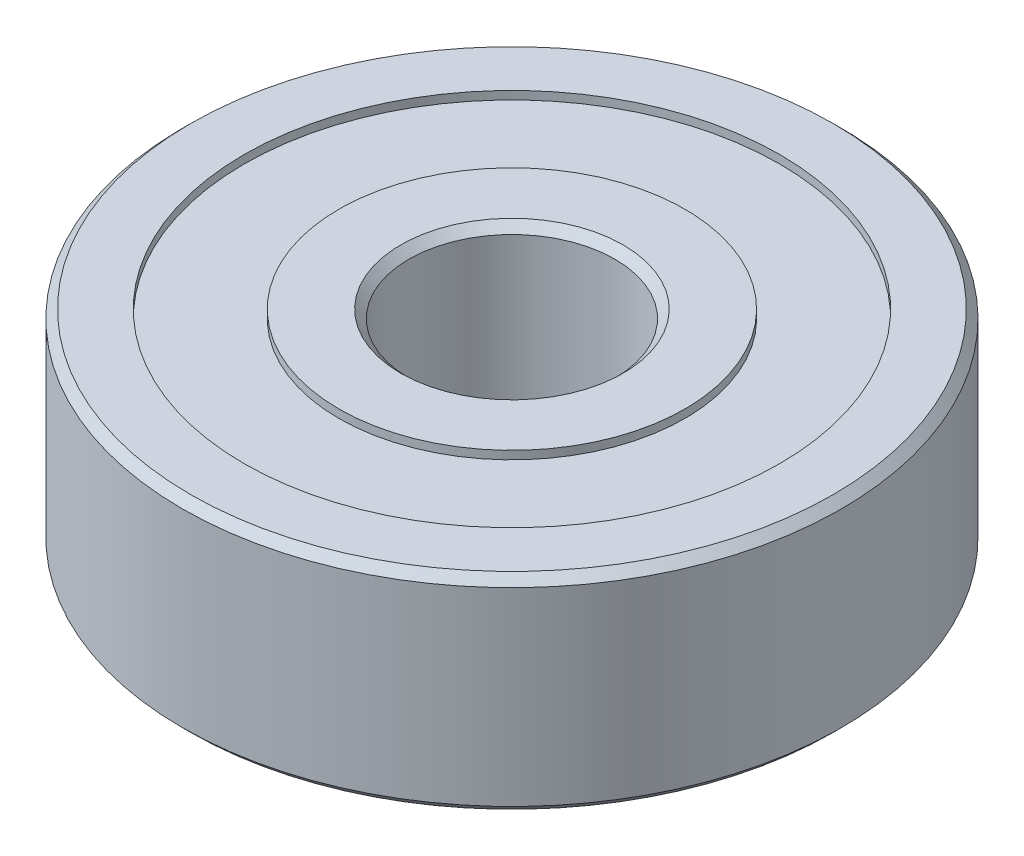
ISO-10303-21;
HEADER;
FILE_DESCRIPTION(('STEP AP214'),'2;1');
FILE_NAME('part.step','',(''),(''),'','','');
FILE_SCHEMA(('AUTOMOTIVE_DESIGN { 1 0 10303 214 1 1 1 1 }'));
ENDSEC;
DATA;
#1=APPLICATION_CONTEXT('core data for automotive mechanical design processes');
#2=APPLICATION_PROTOCOL_DEFINITION('international standard','automotive_design',2000,#1);
#3=PRODUCT_CONTEXT('',#1,'mechanical');
#4=PRODUCT('Part','Part','',(#3));
#5=PRODUCT_RELATED_PRODUCT_CATEGORY('part','',(#4));
#6=PRODUCT_DEFINITION_FORMATION('','',#4);
#7=PRODUCT_DEFINITION_CONTEXT('part definition',#1,'design');
#8=PRODUCT_DEFINITION('design','',#6,#7);
#9=PRODUCT_DEFINITION_SHAPE('','',#8);
#10=(LENGTH_UNIT() NAMED_UNIT(*) SI_UNIT(.MILLI.,.METRE.));
#11=(NAMED_UNIT(*) PLANE_ANGLE_UNIT() SI_UNIT($,.RADIAN.));
#12=(NAMED_UNIT(*) SI_UNIT($,.STERADIAN.) SOLID_ANGLE_UNIT());
#13=UNCERTAINTY_MEASURE_WITH_UNIT(LENGTH_MEASURE(1.E-05),#10,'distance_accuracy_value','');
#14=(GEOMETRIC_REPRESENTATION_CONTEXT(3) GLOBAL_UNCERTAINTY_ASSIGNED_CONTEXT((#13)) GLOBAL_UNIT_ASSIGNED_CONTEXT((#10,
#11,#12)) REPRESENTATION_CONTEXT('',''));
#15=CARTESIAN_POINT('',(0.,0.,0.));
#16=DIRECTION('',(0.,0.,1.));
#17=DIRECTION('',(1.,0.,0.));
#18=AXIS2_PLACEMENT_3D('',#15,#16,#17);
#19=CARTESIAN_POINT('',(0.,0.,0.));
#20=DIRECTION('',(0.,1.,0.));
#21=DIRECTION('',(0.,0.,1.));
#22=AXIS2_PLACEMENT_3D('',#19,#20,#21);
#23=PLANE('',#22);
#24=CARTESIAN_POINT('',(0.,0.,0.));
#25=DIRECTION('',(0.,1.,0.));
#26=DIRECTION('',(0.,0.,1.));
#27=AXIS2_PLACEMENT_3D('',#24,#25,#26);
#28=CIRCLE('',#27,2.69999999999999);
#29=CARTESIAN_POINT('',(0.,0.,2.69999999999999));
#30=VERTEX_POINT('',#29);
#31=EDGE_CURVE('E10',#30,#30,#28,.T.);
#32=ORIENTED_EDGE('',*,*,#31,.T.);
#33=EDGE_LOOP('',(#32));
#34=FACE_BOUND('',#33,.T.);
#35=CARTESIAN_POINT('',(0.,0.,0.));
#36=DIRECTION('',(0.,-1.,0.));
#37=DIRECTION('',(0.,0.,-1.));
#38=AXIS2_PLACEMENT_3D('',#35,#36,#37);
#39=CIRCLE('',#38,4.2);
#40=CARTESIAN_POINT('',(0.,0.,-4.2));
#41=VERTEX_POINT('',#40);
#42=EDGE_CURVE('E87',#41,#41,#39,.T.);
#43=ORIENTED_EDGE('',*,*,#42,.T.);
#44=EDGE_LOOP('',(#43));
#45=FACE_BOUND('',#44,.T.);
#46=ADVANCED_FACE('F35',(#34,#45),#23,.F.);
#47=CARTESIAN_POINT('',(0.,5.,0.));
#48=DIRECTION('',(0.,1.,0.));
#49=DIRECTION('',(0.,0.,1.));
#50=AXIS2_PLACEMENT_3D('',#47,#48,#49);
#51=PLANE('',#50);
#52=CARTESIAN_POINT('',(0.,5.,0.));
#53=DIRECTION('',(0.,1.,0.));
#54=DIRECTION('',(0.,0.,1.));
#55=AXIS2_PLACEMENT_3D('',#52,#53,#54);
#56=CIRCLE('',#55,2.7);
#57=CARTESIAN_POINT('',(0.,5.,2.7));
#58=VERTEX_POINT('',#57);
#59=EDGE_CURVE('E43',#58,#58,#56,.F.);
#60=ORIENTED_EDGE('',*,*,#59,.T.);
#61=EDGE_LOOP('',(#60));
#62=FACE_BOUND('',#61,.T.);
#63=CARTESIAN_POINT('',(0.,5.,0.));
#64=DIRECTION('',(0.,1.,0.));
#65=DIRECTION('',(0.,0.,1.));
#66=AXIS2_PLACEMENT_3D('',#63,#64,#65);
#67=CIRCLE('',#66,4.2);
#68=CARTESIAN_POINT('',(0.,5.,4.2));
#69=VERTEX_POINT('',#68);
#70=EDGE_CURVE('E75',#69,#69,#67,.T.);
#71=ORIENTED_EDGE('',*,*,#70,.T.);
#72=EDGE_LOOP('',(#71));
#73=FACE_BOUND('',#72,.T.);
#74=ADVANCED_FACE('F122',(#62,#73),#51,.T.);
#75=CARTESIAN_POINT('',(0.,5.,0.));
#76=DIRECTION('',(0.,1.,0.));
#77=DIRECTION('',(0.,0.,1.));
#78=AXIS2_PLACEMENT_3D('',#75,#76,#77);
#79=CIRCLE('',#78,7.80000000000001);
#80=CARTESIAN_POINT('',(0.,5.,7.80000000000001));
#81=VERTEX_POINT('',#80);
#82=EDGE_CURVE('E65',#81,#81,#79,.T.);
#83=ORIENTED_EDGE('',*,*,#82,.T.);
#84=EDGE_LOOP('',(#83));
#85=FACE_BOUND('',#84,.T.);
#86=CARTESIAN_POINT('',(0.,5.,0.));
#87=DIRECTION('',(0.,1.,0.));
#88=DIRECTION('',(0.,0.,1.));
#89=AXIS2_PLACEMENT_3D('',#86,#87,#88);
#90=CIRCLE('',#89,6.5);
#91=CARTESIAN_POINT('',(0.,5.,6.5));
#92=VERTEX_POINT('',#91);
#93=EDGE_CURVE('E69',#92,#92,#90,.T.);
#94=ORIENTED_EDGE('',*,*,#93,.F.);
#95=EDGE_LOOP('',(#94));
#96=FACE_BOUND('',#95,.T.);
#97=ADVANCED_FACE('F112',(#85,#96),#51,.T.);
#98=CARTESIAN_POINT('',(0.,0.,0.));
#99=DIRECTION('',(0.,1.,0.));
#100=DIRECTION('',(0.,0.,1.));
#101=AXIS2_PLACEMENT_3D('',#98,#99,#100);
#102=CIRCLE('',#101,7.8);
#103=CARTESIAN_POINT('',(0.,0.,7.8));
#104=VERTEX_POINT('',#103);
#105=EDGE_CURVE('E56',#104,#104,#102,.F.);
#106=ORIENTED_EDGE('',*,*,#105,.T.);
#107=EDGE_LOOP('',(#106));
#108=FACE_BOUND('',#107,.T.);
#109=CARTESIAN_POINT('',(0.,0.,0.));
#110=DIRECTION('',(0.,-1.,0.));
#111=DIRECTION('',(0.,0.,-1.));
#112=AXIS2_PLACEMENT_3D('',#109,#110,#111);
#113=CIRCLE('',#112,6.5);
#114=CARTESIAN_POINT('',(0.,0.,-6.5));
#115=VERTEX_POINT('',#114);
#116=EDGE_CURVE('E81',#115,#115,#113,.T.);
#117=ORIENTED_EDGE('',*,*,#116,.F.);
#118=EDGE_LOOP('',(#117));
#119=FACE_BOUND('',#118,.T.);
#120=ADVANCED_FACE('F109',(#108,#119),#23,.F.);
#121=CARTESIAN_POINT('',(0.,5.,0.));
#122=DIRECTION('',(0.,-1.,0.));
#123=DIRECTION('',(0.,0.,-1.));
#124=AXIS2_PLACEMENT_3D('',#121,#122,#123);
#125=CYLINDRICAL_SURFACE('',#124,8.);
#126=CARTESIAN_POINT('',(0.,4.80000000000001,0.));
#127=DIRECTION('',(0.,1.,0.));
#128=DIRECTION('',(0.,0.,1.));
#129=AXIS2_PLACEMENT_3D('',#126,#127,#128);
#130=CIRCLE('',#129,8.);
#131=CARTESIAN_POINT('',(0.,4.80000000000001,8.));
#132=VERTEX_POINT('',#131);
#133=EDGE_CURVE('E59',#132,#132,#130,.F.);
#134=ORIENTED_EDGE('',*,*,#133,.T.);
#135=EDGE_LOOP('',(#134));
#136=FACE_BOUND('',#135,.T.);
#137=CARTESIAN_POINT('',(0.,0.199999999999999,0.));
#138=DIRECTION('',(0.,1.,0.));
#139=DIRECTION('',(0.,0.,1.));
#140=AXIS2_PLACEMENT_3D('',#137,#138,#139);
#141=CIRCLE('',#140,8.);
#142=CARTESIAN_POINT('',(0.,0.199999999999999,8.));
#143=VERTEX_POINT('',#142);
#144=EDGE_CURVE('E62',#143,#143,#141,.T.);
#145=ORIENTED_EDGE('',*,*,#144,.T.);
#146=EDGE_LOOP('',(#145));
#147=FACE_BOUND('',#146,.T.);
#148=ADVANCED_FACE('F111',(#136,#147),#125,.T.);
#149=CARTESIAN_POINT('',(0.,5.,0.));
#150=DIRECTION('',(0.,-1.,0.));
#151=DIRECTION('',(0.,0.,-1.));
#152=AXIS2_PLACEMENT_3D('',#149,#150,#151);
#153=CYLINDRICAL_SURFACE('',#152,2.5);
#154=CARTESIAN_POINT('',(0.,4.80000000000001,0.));
#155=DIRECTION('',(0.,1.,0.));
#156=DIRECTION('',(0.,0.,1.));
#157=AXIS2_PLACEMENT_3D('',#154,#155,#156);
#158=CIRCLE('',#157,2.5);
#159=CARTESIAN_POINT('',(0.,4.80000000000001,2.5));
#160=VERTEX_POINT('',#159);
#161=EDGE_CURVE('E47',#160,#160,#158,.T.);
#162=ORIENTED_EDGE('',*,*,#161,.T.);
#163=EDGE_LOOP('',(#162));
#164=FACE_BOUND('',#163,.T.);
#165=CARTESIAN_POINT('',(0.,0.199999999999996,0.));
#166=DIRECTION('',(0.,1.,0.));
#167=DIRECTION('',(0.,0.,1.));
#168=AXIS2_PLACEMENT_3D('',#165,#166,#167);
#169=CIRCLE('',#168,2.5);
#170=CARTESIAN_POINT('',(0.,0.199999999999996,2.5));
#171=VERTEX_POINT('',#170);
#172=EDGE_CURVE('E51',#171,#171,#169,.F.);
#173=ORIENTED_EDGE('',*,*,#172,.T.);
#174=EDGE_LOOP('',(#173));
#175=FACE_BOUND('',#174,.T.);
#176=ADVANCED_FACE('F119',(#164,#175),#153,.F.);
#177=CARTESIAN_POINT('',(0.,4.8,0.));
#178=DIRECTION('',(0.,1.,0.));
#179=DIRECTION('',(0.,0.,1.));
#180=AXIS2_PLACEMENT_3D('',#177,#178,#179);
#181=CYLINDRICAL_SURFACE('',#180,6.5);
#182=CARTESIAN_POINT('',(0.,4.8,0.));
#183=DIRECTION('',(0.,1.,0.));
#184=DIRECTION('',(0.,0.,1.));
#185=AXIS2_PLACEMENT_3D('',#182,#183,#184);
#186=CIRCLE('',#185,6.5);
#187=CARTESIAN_POINT('',(0.,4.8,6.5));
#188=VERTEX_POINT('',#187);
#189=EDGE_CURVE('E68',#188,#188,#186,.T.);
#190=ORIENTED_EDGE('',*,*,#189,.F.);
#191=EDGE_LOOP('',(#190));
#192=FACE_BOUND('',#191,.T.);
#193=ORIENTED_EDGE('',*,*,#93,.T.);
#194=EDGE_LOOP('',(#193));
#195=FACE_BOUND('',#194,.T.);
#196=ADVANCED_FACE('F147',(#192,#195),#181,.F.);
#197=CARTESIAN_POINT('',(0.,4.8,0.));
#198=DIRECTION('',(0.,1.,0.));
#199=DIRECTION('',(0.,0.,1.));
#200=AXIS2_PLACEMENT_3D('',#197,#198,#199);
#201=PLANE('',#200);
#202=CARTESIAN_POINT('',(0.,4.8,0.));
#203=DIRECTION('',(0.,1.,0.));
#204=DIRECTION('',(0.,0.,1.));
#205=AXIS2_PLACEMENT_3D('',#202,#203,#204);
#206=CIRCLE('',#205,4.2);
#207=CARTESIAN_POINT('',(0.,4.8,4.2));
#208=VERTEX_POINT('',#207);
#209=EDGE_CURVE('E72',#208,#208,#206,.T.);
#210=ORIENTED_EDGE('',*,*,#209,.F.);
#211=EDGE_LOOP('',(#210));
#212=FACE_BOUND('',#211,.T.);
#213=ORIENTED_EDGE('',*,*,#189,.T.);
#214=EDGE_LOOP('',(#213));
#215=FACE_BOUND('',#214,.T.);
#216=ADVANCED_FACE('F143',(#212,#215),#201,.T.);
#217=CARTESIAN_POINT('',(0.,4.8,0.));
#218=DIRECTION('',(0.,1.,0.));
#219=DIRECTION('',(0.,0.,1.));
#220=AXIS2_PLACEMENT_3D('',#217,#218,#219);
#221=CYLINDRICAL_SURFACE('',#220,4.2);
#222=ORIENTED_EDGE('',*,*,#209,.T.);
#223=EDGE_LOOP('',(#222));
#224=FACE_BOUND('',#223,.T.);
#225=ORIENTED_EDGE('',*,*,#70,.F.);
#226=EDGE_LOOP('',(#225));
#227=FACE_BOUND('',#226,.T.);
#228=ADVANCED_FACE('F105',(#224,#227),#221,.T.);
#229=CARTESIAN_POINT('',(0.,0.2,0.));
#230=DIRECTION('',(0.,-1.,0.));
#231=DIRECTION('',(0.,0.,-1.));
#232=AXIS2_PLACEMENT_3D('',#229,#230,#231);
#233=CYLINDRICAL_SURFACE('',#232,6.5);
#234=CARTESIAN_POINT('',(0.,0.2,0.));
#235=DIRECTION('',(0.,-1.,0.));
#236=DIRECTION('',(0.,0.,-1.));
#237=AXIS2_PLACEMENT_3D('',#234,#235,#236);
#238=CIRCLE('',#237,6.5);
#239=CARTESIAN_POINT('',(0.,0.2,-6.5));
#240=VERTEX_POINT('',#239);
#241=EDGE_CURVE('E78',#240,#240,#238,.T.);
#242=ORIENTED_EDGE('',*,*,#241,.F.);
#243=EDGE_LOOP('',(#242));
#244=FACE_BOUND('',#243,.T.);
#245=ORIENTED_EDGE('',*,*,#116,.T.);
#246=EDGE_LOOP('',(#245));
#247=FACE_BOUND('',#246,.T.);
#248=ADVANCED_FACE('F99',(#244,#247),#233,.F.);
#249=CARTESIAN_POINT('',(0.,0.2,0.));
#250=DIRECTION('',(0.,-1.,0.));
#251=DIRECTION('',(0.,0.,-1.));
#252=AXIS2_PLACEMENT_3D('',#249,#250,#251);
#253=PLANE('',#252);
#254=CARTESIAN_POINT('',(0.,0.2,0.));
#255=DIRECTION('',(0.,-1.,0.));
#256=DIRECTION('',(0.,0.,-1.));
#257=AXIS2_PLACEMENT_3D('',#254,#255,#256);
#258=CIRCLE('',#257,4.2);
#259=CARTESIAN_POINT('',(0.,0.2,-4.2));
#260=VERTEX_POINT('',#259);
#261=EDGE_CURVE('E84',#260,#260,#258,.T.);
#262=ORIENTED_EDGE('',*,*,#261,.F.);
#263=EDGE_LOOP('',(#262));
#264=FACE_BOUND('',#263,.T.);
#265=ORIENTED_EDGE('',*,*,#241,.T.);
#266=EDGE_LOOP('',(#265));
#267=FACE_BOUND('',#266,.T.);
#268=ADVANCED_FACE('F96',(#264,#267),#253,.T.);
#269=CARTESIAN_POINT('',(0.,0.2,0.));
#270=DIRECTION('',(0.,-1.,0.));
#271=DIRECTION('',(0.,0.,-1.));
#272=AXIS2_PLACEMENT_3D('',#269,#270,#271);
#273=CYLINDRICAL_SURFACE('',#272,4.2);
#274=ORIENTED_EDGE('',*,*,#261,.T.);
#275=EDGE_LOOP('',(#274));
#276=FACE_BOUND('',#275,.T.);
#277=ORIENTED_EDGE('',*,*,#42,.F.);
#278=EDGE_LOOP('',(#277));
#279=FACE_BOUND('',#278,.T.);
#280=ADVANCED_FACE('F93',(#276,#279),#273,.T.);
#281=CARTESIAN_POINT('',(0.,5.,0.));
#282=DIRECTION('',(0.,-1.,0.));
#283=DIRECTION('',(0.,0.,-1.));
#284=AXIS2_PLACEMENT_3D('',#281,#282,#283);
#285=CONICAL_SURFACE('',#284,7.80000000000001,0.785398163397448);
#286=ORIENTED_EDGE('',*,*,#133,.F.);
#287=EDGE_LOOP('',(#286));
#288=FACE_BOUND('',#287,.T.);
#289=ORIENTED_EDGE('',*,*,#82,.F.);
#290=EDGE_LOOP('',(#289));
#291=FACE_BOUND('',#290,.T.);
#292=ADVANCED_FACE('F132',(#288,#291),#285,.T.);
#293=CARTESIAN_POINT('',(0.,0.199999999999999,0.));
#294=DIRECTION('',(0.,1.,0.));
#295=DIRECTION('',(0.,0.,1.));
#296=AXIS2_PLACEMENT_3D('',#293,#294,#295);
#297=CONICAL_SURFACE('',#296,8.,0.785398163397444);
#298=ORIENTED_EDGE('',*,*,#105,.F.);
#299=EDGE_LOOP('',(#298));
#300=FACE_BOUND('',#299,.T.);
#301=ORIENTED_EDGE('',*,*,#144,.F.);
#302=EDGE_LOOP('',(#301));
#303=FACE_BOUND('',#302,.T.);
#304=ADVANCED_FACE('F137',(#300,#303),#297,.T.);
#305=CARTESIAN_POINT('',(0.,4.80000000000001,0.));
#306=DIRECTION('',(0.,1.,0.));
#307=DIRECTION('',(0.,0.,1.));
#308=AXIS2_PLACEMENT_3D('',#305,#306,#307);
#309=CONICAL_SURFACE('',#308,2.5,0.785398163397458);
#310=CARTESIAN_POINT('',(0.,5.,2.7));
#311=CARTESIAN_POINT('',(0.,4.99791666666667,2.69791666666666));
#312=CARTESIAN_POINT('',(0.,4.99583333333333,2.69583333333333));
#313=CARTESIAN_POINT('',(0.,4.99166666666667,2.69166666666666));
#314=CARTESIAN_POINT('',(0.,4.98958333333333,2.68958333333333));
#315=CARTESIAN_POINT('',(0.,4.98541666666667,2.68541666666666));
#316=CARTESIAN_POINT('',(0.,4.98333333333333,2.68333333333333));
#317=CARTESIAN_POINT('',(0.,4.97916666666667,2.67916666666666));
#318=CARTESIAN_POINT('',(0.,4.97708333333333,2.67708333333333));
#319=CARTESIAN_POINT('',(0.,4.97291666666667,2.67291666666666));
#320=CARTESIAN_POINT('',(0.,4.97083333333333,2.67083333333333));
#321=CARTESIAN_POINT('',(0.,4.96666666666667,2.66666666666666));
#322=CARTESIAN_POINT('',(0.,4.96458333333333,2.66458333333333));
#323=CARTESIAN_POINT('',(0.,4.96041666666667,2.66041666666666));
#324=CARTESIAN_POINT('',(0.,4.95833333333333,2.65833333333333));
#325=CARTESIAN_POINT('',(0.,4.95416666666667,2.65416666666666));
#326=CARTESIAN_POINT('',(0.,4.95208333333333,2.65208333333333));
#327=CARTESIAN_POINT('',(0.,4.94791666666667,2.64791666666666));
#328=CARTESIAN_POINT('',(0.,4.94583333333333,2.64583333333333));
#329=CARTESIAN_POINT('',(0.,4.94166666666667,2.64166666666666));
#330=CARTESIAN_POINT('',(0.,4.93958333333333,2.63958333333333));
#331=CARTESIAN_POINT('',(0.,4.93541666666667,2.63541666666666));
#332=CARTESIAN_POINT('',(0.,4.93333333333333,2.63333333333333));
#333=CARTESIAN_POINT('',(0.,4.92916666666667,2.62916666666667));
#334=CARTESIAN_POINT('',(0.,4.92708333333334,2.62708333333333));
#335=CARTESIAN_POINT('',(0.,4.92291666666667,2.62291666666666));
#336=CARTESIAN_POINT('',(0.,4.92083333333334,2.62083333333333));
#337=CARTESIAN_POINT('',(0.,4.91666666666667,2.61666666666667));
#338=CARTESIAN_POINT('',(0.,4.91458333333334,2.61458333333333));
#339=CARTESIAN_POINT('',(0.,4.91041666666667,2.61041666666666));
#340=CARTESIAN_POINT('',(0.,4.90833333333334,2.60833333333333));
#341=CARTESIAN_POINT('',(0.,4.90416666666667,2.60416666666667));
#342=CARTESIAN_POINT('',(0.,4.90208333333334,2.60208333333333));
#343=CARTESIAN_POINT('',(0.,4.89791666666667,2.59791666666667));
#344=CARTESIAN_POINT('',(0.,4.89583333333334,2.59583333333333));
#345=CARTESIAN_POINT('',(0.,4.89166666666667,2.59166666666667));
#346=CARTESIAN_POINT('',(0.,4.88958333333334,2.58958333333333));
#347=CARTESIAN_POINT('',(0.,4.88541666666667,2.58541666666667));
#348=CARTESIAN_POINT('',(0.,4.88333333333334,2.58333333333333));
#349=CARTESIAN_POINT('',(0.,4.87916666666667,2.57916666666666));
#350=CARTESIAN_POINT('',(0.,4.87708333333334,2.57708333333333));
#351=CARTESIAN_POINT('',(0.,4.87291666666667,2.57291666666667));
#352=CARTESIAN_POINT('',(0.,4.87083333333334,2.57083333333333));
#353=CARTESIAN_POINT('',(0.,4.86666666666667,2.56666666666667));
#354=CARTESIAN_POINT('',(0.,4.86458333333334,2.56458333333333));
#355=CARTESIAN_POINT('',(0.,4.86041666666667,2.56041666666667));
#356=CARTESIAN_POINT('',(0.,4.85833333333334,2.55833333333333));
#357=CARTESIAN_POINT('',(0.,4.85416666666667,2.55416666666667));
#358=CARTESIAN_POINT('',(0.,4.85208333333334,2.55208333333333));
#359=CARTESIAN_POINT('',(0.,4.84791666666667,2.54791666666667));
#360=CARTESIAN_POINT('',(0.,4.84583333333334,2.54583333333333));
#361=CARTESIAN_POINT('',(0.,4.84166666666667,2.54166666666667));
#362=CARTESIAN_POINT('',(0.,4.83958333333334,2.53958333333333));
#363=CARTESIAN_POINT('',(0.,4.83541666666667,2.53541666666667));
#364=CARTESIAN_POINT('',(0.,4.83333333333334,2.53333333333333));
#365=CARTESIAN_POINT('',(0.,4.82916666666667,2.52916666666667));
#366=CARTESIAN_POINT('',(0.,4.82708333333334,2.52708333333333));
#367=CARTESIAN_POINT('',(0.,4.82291666666667,2.52291666666667));
#368=CARTESIAN_POINT('',(0.,4.82083333333334,2.52083333333333));
#369=CARTESIAN_POINT('',(0.,4.81666666666667,2.51666666666667));
#370=CARTESIAN_POINT('',(0.,4.81458333333334,2.51458333333333));
#371=CARTESIAN_POINT('',(0.,4.81041666666667,2.51041666666667));
#372=CARTESIAN_POINT('',(0.,4.80833333333334,2.50833333333333));
#373=CARTESIAN_POINT('',(0.,4.80416666666667,2.50416666666667));
#374=CARTESIAN_POINT('',(0.,4.80208333333334,2.50208333333333));
#375=CARTESIAN_POINT('',(0.,4.80000000000001,2.5));
#376=B_SPLINE_CURVE_WITH_KNOTS('',3,(#310,#311,#312,#313,#314,#315,#316,#317,#318,#319,#320,
#321,#322,#323,#324,#325,#326,#327,#328,#329,#330,#331,#332,#333,#334,#335,#336,#337,#338,#339,
#340,#341,#342,#343,#344,#345,#346,#347,#348,#349,#350,#351,#352,#353,#354,#355,#356,#357,#358,
#359,#360,#361,#362,#363,#364,#365,#366,#367,#368,#369,#370,#371,#372,#373,#374,#375),
.UNSPECIFIED.,.F.,.F.,(4,2,2,2,2,2,2,2,2,2,2,2,2,2,2,2,2,2,2,2,2,2,2,2,2,2,2,2,2,2,2,2,4),(0.,
0.00883883476483179,0.0176776695296639,0.0265165042944951,0.0353553390593269,0.0441941738241583,
0.0530330085889901,0.0618718433538216,0.0707106781186534,0.0795495128834855,0.0883883476483167,
0.0972271824131485,0.10606601717798,0.114904851942812,0.123743686707643,0.132582521472475,
0.141421356237306,0.150260191002138,0.15909902576697,0.167937860531802,0.176776695296633,
0.185615530061465,0.194454364826297,0.203293199591128,0.21213203435596,0.220970869120792,
0.229809703885623,0.238648538650455,0.247487373415286,0.256326208180118,0.265165042944949,
0.274003877709781,0.282842712474613),.UNSPECIFIED.);
#377=EDGE_CURVE('BSEAM162',#58,#160,#376,.T.);
#378=ORIENTED_EDGE('',*,*,#59,.F.);
#379=ORIENTED_EDGE('',*,*,#161,.F.);
#380=ORIENTED_EDGE('',*,*,#377,.T.);
#381=ORIENTED_EDGE('',*,*,#377,.F.);
#382=EDGE_LOOP('',(#378,#380,#379,#381));
#383=FACE_BOUND('',#382,.T.);
#384=ADVANCED_FACE('F162',(#383),#309,.F.);
#385=CARTESIAN_POINT('',(0.,0.,0.));
#386=DIRECTION('',(0.,-1.,0.));
#387=DIRECTION('',(0.,0.,-1.));
#388=AXIS2_PLACEMENT_3D('',#385,#386,#387);
#389=CONICAL_SURFACE('',#388,2.69999999999999,0.785398163397439);
#390=ORIENTED_EDGE('',*,*,#172,.F.);
#391=EDGE_LOOP('',(#390));
#392=FACE_BOUND('',#391,.T.);
#393=ORIENTED_EDGE('',*,*,#31,.F.);
#394=EDGE_LOOP('',(#393));
#395=FACE_BOUND('',#394,.T.);
#396=ADVANCED_FACE('F38',(#392,#395),#389,.F.);
#397=CLOSED_SHELL('',(#46,#74,#97,#120,#148,#176,#196,#216,#228,#248,#268,#280,#292,#304,#384,#396));
#398=MANIFOLD_SOLID_BREP('B2',#397);
#399=ADVANCED_BREP_SHAPE_REPRESENTATION('',(#18,#398),#14);
#400=SHAPE_DEFINITION_REPRESENTATION(#9,#399);
ENDSEC;
END-ISO-10303-21;
